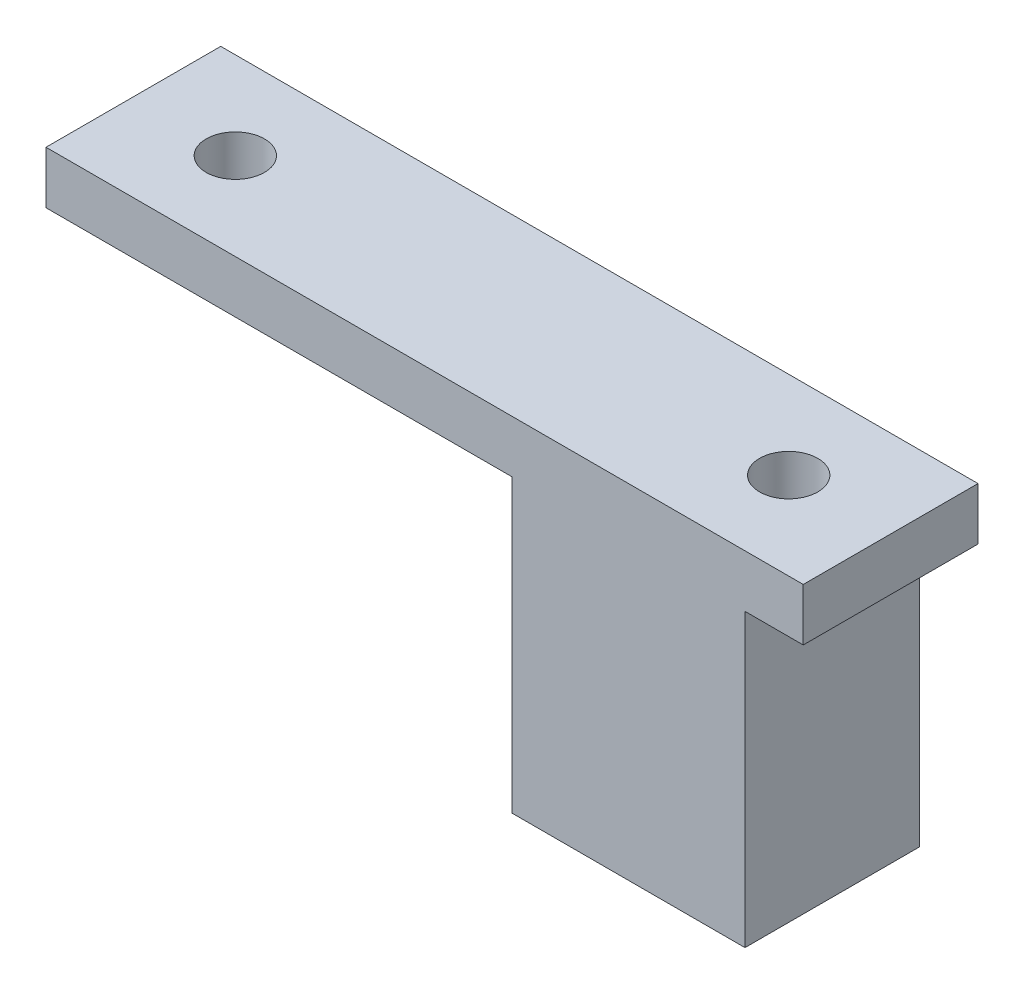
ISO-10303-21;
HEADER;
FILE_DESCRIPTION(('STEP AP214'),'2;1');
FILE_NAME('part.step','',(''),(''),'','','');
FILE_SCHEMA(('AUTOMOTIVE_DESIGN { 1 0 10303 214 1 1 1 1 }'));
ENDSEC;
DATA;
#1=APPLICATION_CONTEXT('core data for automotive mechanical design processes');
#2=APPLICATION_PROTOCOL_DEFINITION('international standard','automotive_design',2000,#1);
#3=PRODUCT_CONTEXT('',#1,'mechanical');
#4=PRODUCT('Part','Part','',(#3));
#5=PRODUCT_RELATED_PRODUCT_CATEGORY('part','',(#4));
#6=PRODUCT_DEFINITION_FORMATION('','',#4);
#7=PRODUCT_DEFINITION_CONTEXT('part definition',#1,'design');
#8=PRODUCT_DEFINITION('design','',#6,#7);
#9=PRODUCT_DEFINITION_SHAPE('','',#8);
#10=(LENGTH_UNIT() NAMED_UNIT(*) SI_UNIT(.MILLI.,.METRE.));
#11=(NAMED_UNIT(*) PLANE_ANGLE_UNIT() SI_UNIT($,.RADIAN.));
#12=(NAMED_UNIT(*) SI_UNIT($,.STERADIAN.) SOLID_ANGLE_UNIT());
#13=UNCERTAINTY_MEASURE_WITH_UNIT(LENGTH_MEASURE(1.E-05),#10,'distance_accuracy_value','');
#14=(GEOMETRIC_REPRESENTATION_CONTEXT(3) GLOBAL_UNCERTAINTY_ASSIGNED_CONTEXT((#13)) GLOBAL_UNIT_ASSIGNED_CONTEXT((#10,
#11,#12)) REPRESENTATION_CONTEXT('',''));
#15=CARTESIAN_POINT('',(0.,0.,0.));
#16=DIRECTION('',(0.,0.,1.));
#17=DIRECTION('',(1.,0.,0.));
#18=AXIS2_PLACEMENT_3D('',#15,#16,#17);
#19=CARTESIAN_POINT('',(0.,10.,0.));
#20=DIRECTION('',(-1.,0.,0.));
#21=DIRECTION('',(0.,0.,1.));
#22=AXIS2_PLACEMENT_3D('',#19,#20,#21);
#23=PLANE('',#22);
#24=DIRECTION('',(0.,0.,-1.));
#25=VECTOR('',#24,1.);
#26=CARTESIAN_POINT('',(0.,0.,0.));
#27=LINE('',#26,#25);
#28=CARTESIAN_POINT('',(0.,0.,0.));
#29=VERTEX_POINT('',#28);
#30=CARTESIAN_POINT('',(0.,0.,-6.));
#31=VERTEX_POINT('',#30);
#32=EDGE_CURVE('E244',#29,#31,#27,.T.);
#33=ORIENTED_EDGE('',*,*,#32,.T.);
#34=DIRECTION('',(0.,-1.,0.));
#35=VECTOR('',#34,1.);
#36=CARTESIAN_POINT('',(0.,10.,-6.));
#37=LINE('',#36,#35);
#38=CARTESIAN_POINT('',(0.,10.,-6.));
#39=VERTEX_POINT('',#38);
#40=EDGE_CURVE('E11',#39,#31,#37,.T.);
#41=ORIENTED_EDGE('',*,*,#40,.F.);
#42=DIRECTION('',(0.,0.,-1.));
#43=VECTOR('',#42,1.);
#44=CARTESIAN_POINT('',(0.,10.,0.));
#45=LINE('',#44,#43);
#46=CARTESIAN_POINT('',(0.,10.,0.));
#47=VERTEX_POINT('',#46);
#48=EDGE_CURVE('E245',#47,#39,#45,.T.);
#49=ORIENTED_EDGE('',*,*,#48,.F.);
#50=DIRECTION('',(0.,-1.,0.));
#51=VECTOR('',#50,1.);
#52=CARTESIAN_POINT('',(0.,10.,0.));
#53=LINE('',#52,#51);
#54=EDGE_CURVE('E63',#47,#29,#53,.T.);
#55=ORIENTED_EDGE('',*,*,#54,.T.);
#56=EDGE_LOOP('',(#33,#41,#49,#55));
#57=FACE_BOUND('',#56,.T.);
#58=ADVANCED_FACE('F39',(#57),#23,.F.);
#59=CARTESIAN_POINT('',(0.,10.,-6.));
#60=DIRECTION('',(0.,0.,1.));
#61=DIRECTION('',(1.,0.,0.));
#62=AXIS2_PLACEMENT_3D('',#59,#60,#61);
#63=PLANE('',#62);
#64=DIRECTION('',(-1.,0.,0.));
#65=VECTOR('',#64,1.);
#66=CARTESIAN_POINT('',(0.,0.,-6.));
#67=LINE('',#66,#65);
#68=CARTESIAN_POINT('',(-8.,0.,-6.));
#69=VERTEX_POINT('',#68);
#70=EDGE_CURVE('E254',#31,#69,#67,.T.);
#71=ORIENTED_EDGE('',*,*,#70,.T.);
#72=DIRECTION('',(0.,-1.,0.));
#73=VECTOR('',#72,1.);
#74=CARTESIAN_POINT('',(-8.,10.,-6.));
#75=LINE('',#74,#73);
#76=CARTESIAN_POINT('',(-8.,10.,-6.));
#77=VERTEX_POINT('',#76);
#78=EDGE_CURVE('E47',#77,#69,#75,.T.);
#79=ORIENTED_EDGE('',*,*,#78,.F.);
#80=DIRECTION('',(-1.,0.,0.));
#81=VECTOR('',#80,1.);
#82=CARTESIAN_POINT('',(2.,10.,-6.));
#83=LINE('',#82,#81);
#84=CARTESIAN_POINT('',(-24.,10.,-6.));
#85=VERTEX_POINT('',#84);
#86=EDGE_CURVE('E225',#77,#85,#83,.T.);
#87=ORIENTED_EDGE('',*,*,#86,.T.);
#88=DIRECTION('',(0.,-1.,0.));
#89=VECTOR('',#88,1.);
#90=CARTESIAN_POINT('',(-24.,11.8,-6.));
#91=LINE('',#90,#89);
#92=CARTESIAN_POINT('',(-24.,11.8,-6.));
#93=VERTEX_POINT('',#92);
#94=EDGE_CURVE('E213',#93,#85,#91,.T.);
#95=ORIENTED_EDGE('',*,*,#94,.F.);
#96=DIRECTION('',(-1.,0.,0.));
#97=VECTOR('',#96,1.);
#98=CARTESIAN_POINT('',(2.,11.8,-6.));
#99=LINE('',#98,#97);
#100=CARTESIAN_POINT('',(2.,11.8,-6.));
#101=VERTEX_POINT('',#100);
#102=EDGE_CURVE('E210',#101,#93,#99,.T.);
#103=ORIENTED_EDGE('',*,*,#102,.F.);
#104=DIRECTION('',(0.,-1.,0.));
#105=VECTOR('',#104,1.);
#106=CARTESIAN_POINT('',(2.,11.8,-6.));
#107=LINE('',#106,#105);
#108=CARTESIAN_POINT('',(2.,10.,-6.));
#109=VERTEX_POINT('',#108);
#110=EDGE_CURVE('E232',#101,#109,#107,.T.);
#111=ORIENTED_EDGE('',*,*,#110,.T.);
#112=EDGE_CURVE('E204',#109,#39,#83,.T.);
#113=ORIENTED_EDGE('',*,*,#112,.T.);
#114=ORIENTED_EDGE('',*,*,#40,.T.);
#115=EDGE_LOOP('',(#71,#79,#87,#95,#103,#111,#113,#114));
#116=FACE_BOUND('',#115,.T.);
#117=ADVANCED_FACE('F286',(#116),#63,.F.);
#118=CARTESIAN_POINT('',(-8.,10.,0.));
#119=DIRECTION('',(1.,0.,0.));
#120=DIRECTION('',(0.,0.,-1.));
#121=AXIS2_PLACEMENT_3D('',#118,#119,#120);
#122=PLANE('',#121);
#123=DIRECTION('',(0.,0.,1.));
#124=VECTOR('',#123,1.);
#125=CARTESIAN_POINT('',(-8.,0.,0.));
#126=LINE('',#125,#124);
#127=CARTESIAN_POINT('',(-8.,0.,0.));
#128=VERTEX_POINT('',#127);
#129=EDGE_CURVE('E257',#69,#128,#126,.T.);
#130=ORIENTED_EDGE('',*,*,#129,.T.);
#131=DIRECTION('',(0.,-1.,0.));
#132=VECTOR('',#131,1.);
#133=CARTESIAN_POINT('',(-8.,10.,0.));
#134=LINE('',#133,#132);
#135=CARTESIAN_POINT('',(-8.,10.,0.));
#136=VERTEX_POINT('',#135);
#137=EDGE_CURVE('E264',#136,#128,#134,.T.);
#138=ORIENTED_EDGE('',*,*,#137,.F.);
#139=DIRECTION('',(0.,0.,1.));
#140=VECTOR('',#139,1.);
#141=CARTESIAN_POINT('',(-8.,10.,0.));
#142=LINE('',#141,#140);
#143=EDGE_CURVE('E248',#77,#136,#142,.T.);
#144=ORIENTED_EDGE('',*,*,#143,.F.);
#145=ORIENTED_EDGE('',*,*,#78,.T.);
#146=EDGE_LOOP('',(#130,#138,#144,#145));
#147=FACE_BOUND('',#146,.T.);
#148=ADVANCED_FACE('F271',(#147),#122,.F.);
#149=CARTESIAN_POINT('',(0.,10.,0.));
#150=DIRECTION('',(0.,0.,-1.));
#151=DIRECTION('',(-1.,0.,0.));
#152=AXIS2_PLACEMENT_3D('',#149,#150,#151);
#153=PLANE('',#152);
#154=DIRECTION('',(1.,0.,0.));
#155=VECTOR('',#154,1.);
#156=CARTESIAN_POINT('',(0.,0.,0.));
#157=LINE('',#156,#155);
#158=EDGE_CURVE('E82',#128,#29,#157,.T.);
#159=ORIENTED_EDGE('',*,*,#158,.T.);
#160=ORIENTED_EDGE('',*,*,#54,.F.);
#161=DIRECTION('',(1.,0.,0.));
#162=VECTOR('',#161,1.);
#163=CARTESIAN_POINT('',(1.99999999999999,10.,0.));
#164=LINE('',#163,#162);
#165=CARTESIAN_POINT('',(1.99999999999999,10.,0.));
#166=VERTEX_POINT('',#165);
#167=EDGE_CURVE('E217',#47,#166,#164,.T.);
#168=ORIENTED_EDGE('',*,*,#167,.T.);
#169=DIRECTION('',(0.,-1.,0.));
#170=VECTOR('',#169,1.);
#171=CARTESIAN_POINT('',(1.99999999999999,11.8,0.));
#172=LINE('',#171,#170);
#173=CARTESIAN_POINT('',(1.99999999999999,11.8,0.));
#174=VERTEX_POINT('',#173);
#175=EDGE_CURVE('E236',#174,#166,#172,.T.);
#176=ORIENTED_EDGE('',*,*,#175,.F.);
#177=DIRECTION('',(1.,0.,0.));
#178=VECTOR('',#177,1.);
#179=CARTESIAN_POINT('',(1.99999999999999,11.8,0.));
#180=LINE('',#179,#178);
#181=CARTESIAN_POINT('',(-24.,11.8,0.));
#182=VERTEX_POINT('',#181);
#183=EDGE_CURVE('E203',#182,#174,#180,.T.);
#184=ORIENTED_EDGE('',*,*,#183,.F.);
#185=DIRECTION('',(0.,-1.,0.));
#186=VECTOR('',#185,1.);
#187=CARTESIAN_POINT('',(-24.,11.8,0.));
#188=LINE('',#187,#186);
#189=CARTESIAN_POINT('',(-24.,10.,0.));
#190=VERTEX_POINT('',#189);
#191=EDGE_CURVE('E240',#182,#190,#188,.T.);
#192=ORIENTED_EDGE('',*,*,#191,.T.);
#193=EDGE_CURVE('E218',#190,#136,#164,.T.);
#194=ORIENTED_EDGE('',*,*,#193,.T.);
#195=ORIENTED_EDGE('',*,*,#137,.T.);
#196=EDGE_LOOP('',(#159,#160,#168,#176,#184,#192,#194,#195));
#197=FACE_BOUND('',#196,.T.);
#198=ADVANCED_FACE('F295',(#197),#153,.F.);
#199=CARTESIAN_POINT('',(0.,0.,0.));
#200=DIRECTION('',(0.,1.,0.));
#201=DIRECTION('',(0.,0.,1.));
#202=AXIS2_PLACEMENT_3D('',#199,#200,#201);
#203=PLANE('',#202);
#204=DIRECTION('',(1.,0.,0.));
#205=VECTOR('',#204,1.);
#206=CARTESIAN_POINT('',(-1.05,0.,-4.6));
#207=LINE('',#206,#205);
#208=CARTESIAN_POINT('',(-6.95,0.,-4.6));
#209=VERTEX_POINT('',#208);
#210=CARTESIAN_POINT('',(-1.05,0.,-4.6));
#211=VERTEX_POINT('',#210);
#212=EDGE_CURVE('E172',#209,#211,#207,.T.);
#213=ORIENTED_EDGE('',*,*,#212,.F.);
#214=DIRECTION('',(0.,0.,-1.));
#215=VECTOR('',#214,1.);
#216=CARTESIAN_POINT('',(-6.95,0.,-4.6));
#217=LINE('',#216,#215);
#218=CARTESIAN_POINT('',(-6.95,0.,-1.4));
#219=VERTEX_POINT('',#218);
#220=EDGE_CURVE('E54',#219,#209,#217,.T.);
#221=ORIENTED_EDGE('',*,*,#220,.F.);
#222=DIRECTION('',(-1.,0.,0.));
#223=VECTOR('',#222,1.);
#224=CARTESIAN_POINT('',(-1.05,0.,-1.4));
#225=LINE('',#224,#223);
#226=CARTESIAN_POINT('',(-1.05,0.,-1.4));
#227=VERTEX_POINT('',#226);
#228=EDGE_CURVE('E157',#227,#219,#225,.T.);
#229=ORIENTED_EDGE('',*,*,#228,.F.);
#230=DIRECTION('',(0.,0.,1.));
#231=VECTOR('',#230,1.);
#232=CARTESIAN_POINT('',(-1.05,0.,-4.6));
#233=LINE('',#232,#231);
#234=EDGE_CURVE('E161',#211,#227,#233,.T.);
#235=ORIENTED_EDGE('',*,*,#234,.F.);
#236=EDGE_LOOP('',(#213,#221,#229,#235));
#237=FACE_BOUND('',#236,.T.);
#238=ORIENTED_EDGE('',*,*,#32,.F.);
#239=ORIENTED_EDGE('',*,*,#158,.F.);
#240=ORIENTED_EDGE('',*,*,#129,.F.);
#241=ORIENTED_EDGE('',*,*,#70,.F.);
#242=EDGE_LOOP('',(#238,#239,#240,#241));
#243=FACE_BOUND('',#242,.T.);
#244=ADVANCED_FACE('F276',(#237,#243),#203,.F.);
#245=CARTESIAN_POINT('',(0.,10.,0.));
#246=DIRECTION('',(0.,1.,0.));
#247=DIRECTION('',(0.,0.,1.));
#248=AXIS2_PLACEMENT_3D('',#245,#246,#247);
#249=PLANE('',#248);
#250=ORIENTED_EDGE('',*,*,#167,.F.);
#251=ORIENTED_EDGE('',*,*,#48,.T.);
#252=ORIENTED_EDGE('',*,*,#112,.F.);
#253=DIRECTION('',(0.,0.,-1.));
#254=VECTOR('',#253,1.);
#255=CARTESIAN_POINT('',(1.99999999999999,10.,0.));
#256=LINE('',#255,#254);
#257=EDGE_CURVE('E222',#166,#109,#256,.T.);
#258=ORIENTED_EDGE('',*,*,#257,.F.);
#259=EDGE_LOOP('',(#250,#251,#252,#258));
#260=FACE_BOUND('',#259,.T.);
#261=ADVANCED_FACE('F281',(#260),#249,.F.);
#262=CARTESIAN_POINT('',(-20.5,10.,-3.));
#263=DIRECTION('',(0.,1.,0.));
#264=DIRECTION('',(0.,0.,1.));
#265=AXIS2_PLACEMENT_3D('',#262,#263,#264);
#266=CIRCLE('',#265,1.);
#267=CARTESIAN_POINT('',(-20.5,10.,-2.));
#268=VERTEX_POINT('',#267);
#269=EDGE_CURVE('E190',#268,#268,#266,.T.);
#270=ORIENTED_EDGE('',*,*,#269,.T.);
#271=EDGE_LOOP('',(#270));
#272=FACE_BOUND('',#271,.T.);
#273=ORIENTED_EDGE('',*,*,#86,.F.);
#274=ORIENTED_EDGE('',*,*,#143,.T.);
#275=ORIENTED_EDGE('',*,*,#193,.F.);
#276=DIRECTION('',(0.,0.,1.));
#277=VECTOR('',#276,1.);
#278=CARTESIAN_POINT('',(-24.,10.,0.));
#279=LINE('',#278,#277);
#280=EDGE_CURVE('E195',#85,#190,#279,.T.);
#281=ORIENTED_EDGE('',*,*,#280,.F.);
#282=EDGE_LOOP('',(#273,#274,#275,#281));
#283=FACE_BOUND('',#282,.T.);
#284=ADVANCED_FACE('F294',(#272,#283),#249,.F.);
#285=CARTESIAN_POINT('',(0.,11.8,0.));
#286=DIRECTION('',(0.,1.,0.));
#287=DIRECTION('',(0.,0.,1.));
#288=AXIS2_PLACEMENT_3D('',#285,#286,#287);
#289=PLANE('',#288);
#290=CARTESIAN_POINT('',(-20.5,11.8,-3.));
#291=DIRECTION('',(0.,1.,0.));
#292=DIRECTION('',(0.,0.,1.));
#293=AXIS2_PLACEMENT_3D('',#290,#291,#292);
#294=CIRCLE('',#293,1.);
#295=CARTESIAN_POINT('',(-20.5,11.8,-2.));
#296=VERTEX_POINT('',#295);
#297=EDGE_CURVE('E191',#296,#296,#294,.T.);
#298=ORIENTED_EDGE('',*,*,#297,.F.);
#299=EDGE_LOOP('',(#298));
#300=FACE_BOUND('',#299,.T.);
#301=DIRECTION('',(0.,0.,1.));
#302=VECTOR('',#301,1.);
#303=CARTESIAN_POINT('',(-24.,11.8,0.));
#304=LINE('',#303,#302);
#305=EDGE_CURVE('E199',#93,#182,#304,.T.);
#306=ORIENTED_EDGE('',*,*,#305,.T.);
#307=ORIENTED_EDGE('',*,*,#183,.T.);
#308=DIRECTION('',(0.,0.,-1.));
#309=VECTOR('',#308,1.);
#310=CARTESIAN_POINT('',(1.99999999999999,11.8,0.));
#311=LINE('',#310,#309);
#312=EDGE_CURVE('E207',#174,#101,#311,.T.);
#313=ORIENTED_EDGE('',*,*,#312,.T.);
#314=ORIENTED_EDGE('',*,*,#102,.T.);
#315=EDGE_LOOP('',(#306,#307,#313,#314));
#316=FACE_BOUND('',#315,.T.);
#317=CARTESIAN_POINT('',(-1.5,11.8,-3.));
#318=DIRECTION('',(0.,1.,0.));
#319=DIRECTION('',(0.,0.,-1.));
#320=AXIS2_PLACEMENT_3D('',#317,#318,#319);
#321=CIRCLE('',#320,1.);
#322=CARTESIAN_POINT('',(-1.5,11.8,-4.));
#323=VERTEX_POINT('',#322);
#324=EDGE_CURVE('E181',#323,#323,#321,.T.);
#325=ORIENTED_EDGE('',*,*,#324,.F.);
#326=EDGE_LOOP('',(#325));
#327=FACE_BOUND('',#326,.T.);
#328=ADVANCED_FACE('F298',(#300,#316,#327),#289,.T.);
#329=CARTESIAN_POINT('',(-24.,11.8,0.));
#330=DIRECTION('',(1.,0.,0.));
#331=DIRECTION('',(0.,0.,-1.));
#332=AXIS2_PLACEMENT_3D('',#329,#330,#331);
#333=PLANE('',#332);
#334=ORIENTED_EDGE('',*,*,#280,.T.);
#335=ORIENTED_EDGE('',*,*,#191,.F.);
#336=ORIENTED_EDGE('',*,*,#305,.F.);
#337=ORIENTED_EDGE('',*,*,#94,.T.);
#338=EDGE_LOOP('',(#334,#335,#336,#337));
#339=FACE_BOUND('',#338,.T.);
#340=ADVANCED_FACE('F292',(#339),#333,.F.);
#341=CARTESIAN_POINT('',(1.99999999999999,11.8,0.));
#342=DIRECTION('',(-1.,0.,0.));
#343=DIRECTION('',(0.,0.,1.));
#344=AXIS2_PLACEMENT_3D('',#341,#342,#343);
#345=PLANE('',#344);
#346=ORIENTED_EDGE('',*,*,#257,.T.);
#347=ORIENTED_EDGE('',*,*,#110,.F.);
#348=ORIENTED_EDGE('',*,*,#312,.F.);
#349=ORIENTED_EDGE('',*,*,#175,.T.);
#350=EDGE_LOOP('',(#346,#347,#348,#349));
#351=FACE_BOUND('',#350,.T.);
#352=ADVANCED_FACE('F302',(#351),#345,.F.);
#353=CARTESIAN_POINT('',(-20.5,11.8,-3.));
#354=DIRECTION('',(0.,-1.,0.));
#355=DIRECTION('',(0.,0.,-1.));
#356=AXIS2_PLACEMENT_3D('',#353,#354,#355);
#357=CYLINDRICAL_SURFACE('',#356,1.);
#358=ORIENTED_EDGE('',*,*,#297,.T.);
#359=EDGE_LOOP('',(#358));
#360=FACE_BOUND('',#359,.T.);
#361=ORIENTED_EDGE('',*,*,#269,.F.);
#362=EDGE_LOOP('',(#361));
#363=FACE_BOUND('',#362,.T.);
#364=ADVANCED_FACE('F304',(#360,#363),#357,.F.);
#365=CARTESIAN_POINT('',(-1.5,11.8,-3.));
#366=DIRECTION('',(0.,-1.,0.));
#367=DIRECTION('',(0.,0.,-1.));
#368=AXIS2_PLACEMENT_3D('',#365,#366,#367);
#369=CYLINDRICAL_SURFACE('',#368,1.);
#370=ORIENTED_EDGE('',*,*,#324,.T.);
#371=EDGE_LOOP('',(#370));
#372=FACE_BOUND('',#371,.T.);
#373=CARTESIAN_POINT('',(-1.5,7.8,-3.));
#374=DIRECTION('',(0.,1.,0.));
#375=DIRECTION('',(0.,0.,1.));
#376=AXIS2_PLACEMENT_3D('',#373,#374,#375);
#377=CIRCLE('',#376,1.);
#378=CARTESIAN_POINT('',(-1.5,7.8,-2.));
#379=VERTEX_POINT('',#378);
#380=EDGE_CURVE('E164',#379,#379,#377,.T.);
#381=ORIENTED_EDGE('',*,*,#380,.F.);
#382=EDGE_LOOP('',(#381));
#383=FACE_BOUND('',#382,.T.);
#384=ADVANCED_FACE('F310',(#372,#383),#369,.F.);
#385=CARTESIAN_POINT('',(-6.95,7.,-4.6));
#386=DIRECTION('',(-1.,0.,0.));
#387=DIRECTION('',(0.,0.,1.));
#388=AXIS2_PLACEMENT_3D('',#385,#386,#387);
#389=PLANE('',#388);
#390=ORIENTED_EDGE('',*,*,#220,.T.);
#391=DIRECTION('',(0.,-1.,0.));
#392=VECTOR('',#391,1.);
#393=CARTESIAN_POINT('',(-6.95,7.,-4.6));
#394=LINE('',#393,#392);
#395=CARTESIAN_POINT('',(-6.95,7.,-4.6));
#396=VERTEX_POINT('',#395);
#397=EDGE_CURVE('E132',#396,#209,#394,.T.);
#398=ORIENTED_EDGE('',*,*,#397,.F.);
#399=DIRECTION('',(0.,0.,-1.));
#400=VECTOR('',#399,1.);
#401=CARTESIAN_POINT('',(-6.95,7.,-4.6));
#402=LINE('',#401,#400);
#403=CARTESIAN_POINT('',(-6.95,7.,-1.4));
#404=VERTEX_POINT('',#403);
#405=EDGE_CURVE('E136',#404,#396,#402,.T.);
#406=ORIENTED_EDGE('',*,*,#405,.F.);
#407=DIRECTION('',(0.,-1.,0.));
#408=VECTOR('',#407,1.);
#409=CARTESIAN_POINT('',(-6.95,7.,-1.4));
#410=LINE('',#409,#408);
#411=EDGE_CURVE('E178',#404,#219,#410,.T.);
#412=ORIENTED_EDGE('',*,*,#411,.T.);
#413=EDGE_LOOP('',(#390,#398,#406,#412));
#414=FACE_BOUND('',#413,.T.);
#415=ADVANCED_FACE('F134',(#414),#389,.F.);
#416=CARTESIAN_POINT('',(-1.05,7.,-1.4));
#417=DIRECTION('',(0.,0.,1.));
#418=DIRECTION('',(1.,0.,0.));
#419=AXIS2_PLACEMENT_3D('',#416,#417,#418);
#420=PLANE('',#419);
#421=ORIENTED_EDGE('',*,*,#228,.T.);
#422=ORIENTED_EDGE('',*,*,#411,.F.);
#423=DIRECTION('',(-1.,0.,0.));
#424=VECTOR('',#423,1.);
#425=CARTESIAN_POINT('',(-1.05,7.,-1.4));
#426=LINE('',#425,#424);
#427=CARTESIAN_POINT('',(-1.05,7.,-1.4));
#428=VERTEX_POINT('',#427);
#429=EDGE_CURVE('E143',#428,#404,#426,.T.);
#430=ORIENTED_EDGE('',*,*,#429,.F.);
#431=DIRECTION('',(0.,-1.,0.));
#432=VECTOR('',#431,1.);
#433=CARTESIAN_POINT('',(-1.05,7.,-1.4));
#434=LINE('',#433,#432);
#435=EDGE_CURVE('E182',#428,#227,#434,.T.);
#436=ORIENTED_EDGE('',*,*,#435,.T.);
#437=EDGE_LOOP('',(#421,#422,#430,#436));
#438=FACE_BOUND('',#437,.T.);
#439=ADVANCED_FACE('F336',(#438),#420,.F.);
#440=CARTESIAN_POINT('',(-1.05,7.,-4.6));
#441=DIRECTION('',(1.,0.,0.));
#442=DIRECTION('',(0.,0.,-1.));
#443=AXIS2_PLACEMENT_3D('',#440,#441,#442);
#444=PLANE('',#443);
#445=ORIENTED_EDGE('',*,*,#234,.T.);
#446=ORIENTED_EDGE('',*,*,#435,.F.);
#447=DIRECTION('',(0.,0.,1.));
#448=VECTOR('',#447,1.);
#449=CARTESIAN_POINT('',(-1.05,7.,-4.6));
#450=LINE('',#449,#448);
#451=CARTESIAN_POINT('',(-1.05,7.,-4.6));
#452=VERTEX_POINT('',#451);
#453=EDGE_CURVE('E152',#452,#428,#450,.T.);
#454=ORIENTED_EDGE('',*,*,#453,.F.);
#455=DIRECTION('',(0.,-1.,0.));
#456=VECTOR('',#455,1.);
#457=CARTESIAN_POINT('',(-1.05,7.,-4.6));
#458=LINE('',#457,#456);
#459=EDGE_CURVE('E142',#452,#211,#458,.T.);
#460=ORIENTED_EDGE('',*,*,#459,.T.);
#461=EDGE_LOOP('',(#445,#446,#454,#460));
#462=FACE_BOUND('',#461,.T.);
#463=ADVANCED_FACE('F334',(#462),#444,.F.);
#464=CARTESIAN_POINT('',(-1.05,7.,-4.6));
#465=DIRECTION('',(0.,0.,-1.));
#466=DIRECTION('',(-1.,0.,0.));
#467=AXIS2_PLACEMENT_3D('',#464,#465,#466);
#468=PLANE('',#467);
#469=ORIENTED_EDGE('',*,*,#212,.T.);
#470=ORIENTED_EDGE('',*,*,#459,.F.);
#471=DIRECTION('',(1.,0.,0.));
#472=VECTOR('',#471,1.);
#473=CARTESIAN_POINT('',(-1.05,7.,-4.6));
#474=LINE('',#473,#472);
#475=EDGE_CURVE('E146',#396,#452,#474,.T.);
#476=ORIENTED_EDGE('',*,*,#475,.F.);
#477=ORIENTED_EDGE('',*,*,#397,.T.);
#478=EDGE_LOOP('',(#469,#470,#476,#477));
#479=FACE_BOUND('',#478,.T.);
#480=ADVANCED_FACE('F147',(#479),#468,.F.);
#481=CARTESIAN_POINT('',(0.,7.,0.));
#482=DIRECTION('',(0.,-1.,0.));
#483=DIRECTION('',(0.,0.,-1.));
#484=AXIS2_PLACEMENT_3D('',#481,#482,#483);
#485=PLANE('',#484);
#486=ORIENTED_EDGE('',*,*,#405,.T.);
#487=ORIENTED_EDGE('',*,*,#475,.T.);
#488=ORIENTED_EDGE('',*,*,#453,.T.);
#489=ORIENTED_EDGE('',*,*,#429,.T.);
#490=EDGE_LOOP('',(#486,#487,#488,#489));
#491=FACE_BOUND('',#490,.T.);
#492=ADVANCED_FACE('F154',(#491),#485,.T.);
#493=CARTESIAN_POINT('',(-1.5,7.8,-3.));
#494=DIRECTION('',(0.,1.,0.));
#495=DIRECTION('',(0.,0.,1.));
#496=AXIS2_PLACEMENT_3D('',#493,#494,#495);
#497=PLANE('',#496);
#498=ORIENTED_EDGE('',*,*,#380,.T.);
#499=EDGE_LOOP('',(#498));
#500=FACE_BOUND('',#499,.T.);
#501=ADVANCED_FACE('F433',(#500),#497,.T.);
#502=CLOSED_SHELL('',(#58,#117,#148,#198,#244,#261,#284,#328,#340,#352,#364,#384,#415,#439,#463,
#480,#492,#501));
#503=MANIFOLD_SOLID_BREP('B2',#502);
#504=ADVANCED_BREP_SHAPE_REPRESENTATION('',(#18,#503),#14);
#505=SHAPE_DEFINITION_REPRESENTATION(#9,#504);
ENDSEC;
END-ISO-10303-21;
